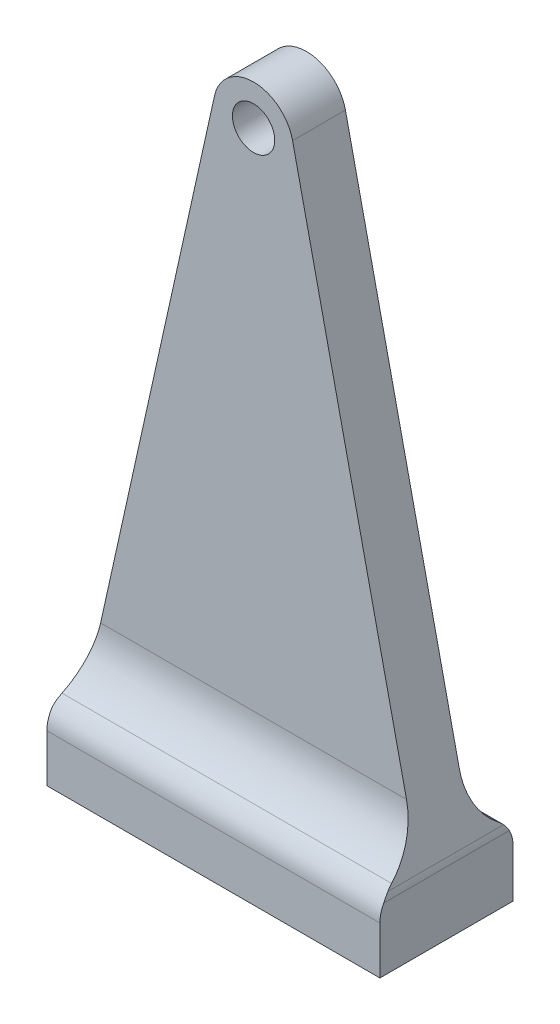
ISO-10303-21;
HEADER;
FILE_DESCRIPTION(('STEP AP214'),'2;1');
FILE_NAME('part.step','',(''),(''),'','','');
FILE_SCHEMA(('AUTOMOTIVE_DESIGN { 1 0 10303 214 1 1 1 1 }'));
ENDSEC;
DATA;
#1=APPLICATION_CONTEXT('core data for automotive mechanical design processes');
#2=APPLICATION_PROTOCOL_DEFINITION('international standard','automotive_design',2000,#1);
#3=PRODUCT_CONTEXT('',#1,'mechanical');
#4=PRODUCT('Part','Part','',(#3));
#5=PRODUCT_RELATED_PRODUCT_CATEGORY('part','',(#4));
#6=PRODUCT_DEFINITION_FORMATION('','',#4);
#7=PRODUCT_DEFINITION_CONTEXT('part definition',#1,'design');
#8=PRODUCT_DEFINITION('design','',#6,#7);
#9=PRODUCT_DEFINITION_SHAPE('','',#8);
#10=(LENGTH_UNIT() NAMED_UNIT(*) SI_UNIT(.MILLI.,.METRE.));
#11=(NAMED_UNIT(*) PLANE_ANGLE_UNIT() SI_UNIT($,.RADIAN.));
#12=(NAMED_UNIT(*) SI_UNIT($,.STERADIAN.) SOLID_ANGLE_UNIT());
#13=UNCERTAINTY_MEASURE_WITH_UNIT(LENGTH_MEASURE(1.E-05),#10,'distance_accuracy_value','');
#14=(GEOMETRIC_REPRESENTATION_CONTEXT(3) GLOBAL_UNCERTAINTY_ASSIGNED_CONTEXT((#13)) GLOBAL_UNIT_ASSIGNED_CONTEXT((#10,
#11,#12)) REPRESENTATION_CONTEXT('',''));
#15=CARTESIAN_POINT('',(0.,0.,0.));
#16=DIRECTION('',(0.,0.,1.));
#17=DIRECTION('',(1.,0.,0.));
#18=AXIS2_PLACEMENT_3D('',#15,#16,#17);
#19=CARTESIAN_POINT('',(0.,85.,20.));
#20=DIRECTION('',(0.,0.,1.));
#21=DIRECTION('',(1.,0.,0.));
#22=AXIS2_PLACEMENT_3D('',#19,#20,#21);
#23=PLANE('',#22);
#24=DIRECTION('',(0.,1.,0.));
#25=VECTOR('',#24,1.);
#26=CARTESIAN_POINT('',(25.,0.,20.));
#27=LINE('',#26,#25);
#28=CARTESIAN_POINT('',(25.,-10.,20.));
#29=VERTEX_POINT('',#28);
#30=CARTESIAN_POINT('',(25.,-2.84464736703942,20.));
#31=VERTEX_POINT('',#30);
#32=EDGE_CURVE('E173',#29,#31,#27,.T.);
#33=ORIENTED_EDGE('',*,*,#32,.T.);
#34=DIRECTION('',(-1.,0.,0.));
#35=VECTOR('',#34,1.);
#36=CARTESIAN_POINT('',(-25.,-2.84464736703942,20.));
#37=LINE('',#36,#35);
#38=CARTESIAN_POINT('',(-25.,-2.84464736703942,20.));
#39=VERTEX_POINT('',#38);
#40=EDGE_CURVE('E55',#31,#39,#37,.T.);
#41=ORIENTED_EDGE('',*,*,#40,.T.);
#42=DIRECTION('',(0.,-1.,0.));
#43=VECTOR('',#42,1.);
#44=CARTESIAN_POINT('',(-25.,0.,20.));
#45=LINE('',#44,#43);
#46=CARTESIAN_POINT('',(-25.,-10.,20.));
#47=VERTEX_POINT('',#46);
#48=EDGE_CURVE('E338',#39,#47,#45,.T.);
#49=ORIENTED_EDGE('',*,*,#48,.T.);
#50=DIRECTION('',(1.,0.,0.));
#51=VECTOR('',#50,1.);
#52=CARTESIAN_POINT('',(-25.,-10.,20.));
#53=LINE('',#52,#51);
#54=EDGE_CURVE('E179',#47,#29,#53,.T.);
#55=ORIENTED_EDGE('',*,*,#54,.T.);
#56=EDGE_LOOP('',(#33,#41,#49,#55));
#57=FACE_BOUND('',#56,.T.);
#58=ADVANCED_FACE('F41',(#57),#23,.T.);
#59=CARTESIAN_POINT('',(0.,85.,0.));
#60=DIRECTION('',(0.,0.,1.));
#61=DIRECTION('',(1.,0.,0.));
#62=AXIS2_PLACEMENT_3D('',#59,#60,#61);
#63=PLANE('',#62);
#64=DIRECTION('',(0.,-1.,0.));
#65=VECTOR('',#64,1.);
#66=CARTESIAN_POINT('',(-25.,0.,0.));
#67=LINE('',#66,#65);
#68=CARTESIAN_POINT('',(-25.,-2.84464736703942,0.));
#69=VERTEX_POINT('',#68);
#70=CARTESIAN_POINT('',(-25.,-10.,0.));
#71=VERTEX_POINT('',#70);
#72=EDGE_CURVE('E337',#69,#71,#67,.T.);
#73=ORIENTED_EDGE('',*,*,#72,.F.);
#74=DIRECTION('',(1.,0.,0.));
#75=VECTOR('',#74,1.);
#76=CARTESIAN_POINT('',(0.,-2.84464736703942,0.));
#77=LINE('',#76,#75);
#78=CARTESIAN_POINT('',(25.,-2.84464736703942,0.));
#79=VERTEX_POINT('',#78);
#80=EDGE_CURVE('E234',#69,#79,#77,.T.);
#81=ORIENTED_EDGE('',*,*,#80,.T.);
#82=DIRECTION('',(0.,1.,0.));
#83=VECTOR('',#82,1.);
#84=CARTESIAN_POINT('',(25.,0.,0.));
#85=LINE('',#84,#83);
#86=CARTESIAN_POINT('',(25.,-10.,0.));
#87=VERTEX_POINT('',#86);
#88=EDGE_CURVE('E182',#87,#79,#85,.T.);
#89=ORIENTED_EDGE('',*,*,#88,.F.);
#90=DIRECTION('',(1.,0.,0.));
#91=VECTOR('',#90,1.);
#92=CARTESIAN_POINT('',(-25.,-10.,0.));
#93=LINE('',#92,#91);
#94=EDGE_CURVE('E341',#71,#87,#93,.T.);
#95=ORIENTED_EDGE('',*,*,#94,.F.);
#96=EDGE_LOOP('',(#73,#81,#89,#95));
#97=FACE_BOUND('',#96,.T.);
#98=ADVANCED_FACE('F274',(#97),#63,.F.);
#99=CARTESIAN_POINT('',(0.,85.,20.));
#100=DIRECTION('',(0.,0.,-1.));
#101=DIRECTION('',(-1.,0.,0.));
#102=AXIS2_PLACEMENT_3D('',#99,#100,#101);
#103=CYLINDRICAL_SURFACE('',#102,6.);
#104=CARTESIAN_POINT('',(0.,85.,13.96875));
#105=DIRECTION('',(0.,0.,1.));
#106=DIRECTION('',(1.,0.,0.));
#107=AXIS2_PLACEMENT_3D('',#104,#105,#106);
#108=CIRCLE('',#107,6.);
#109=CARTESIAN_POINT('',(5.85762860973803,86.2993025322759,13.96875));
#110=VERTEX_POINT('',#109);
#111=CARTESIAN_POINT('',(-5.85762860973803,86.2993025322759,13.96875));
#112=VERTEX_POINT('',#111);
#113=EDGE_CURVE('E171',#110,#112,#108,.T.);
#114=ORIENTED_EDGE('',*,*,#113,.F.);
#115=DIRECTION('',(0.,0.,-1.));
#116=VECTOR('',#115,1.);
#117=CARTESIAN_POINT('',(5.85762860973803,86.2993025322759,20.));
#118=LINE('',#117,#116);
#119=CARTESIAN_POINT('',(5.85762860973803,86.2993025322759,6.03125));
#120=VERTEX_POINT('',#119);
#121=EDGE_CURVE('E164',#110,#120,#118,.T.);
#122=ORIENTED_EDGE('',*,*,#121,.T.);
#123=CARTESIAN_POINT('',(0.,85.,6.03125));
#124=DIRECTION('',(0.,0.,-1.));
#125=DIRECTION('',(-1.,0.,0.));
#126=AXIS2_PLACEMENT_3D('',#123,#124,#125);
#127=CIRCLE('',#126,6.);
#128=CARTESIAN_POINT('',(-5.85762860973803,86.2993025322759,6.03125));
#129=VERTEX_POINT('',#128);
#130=EDGE_CURVE('E147',#129,#120,#127,.T.);
#131=ORIENTED_EDGE('',*,*,#130,.F.);
#132=DIRECTION('',(0.,0.,-1.));
#133=VECTOR('',#132,1.);
#134=CARTESIAN_POINT('',(-5.85762860973803,86.2993025322759,20.));
#135=LINE('',#134,#133);
#136=EDGE_CURVE('E187',#112,#129,#135,.T.);
#137=ORIENTED_EDGE('',*,*,#136,.F.);
#138=EDGE_LOOP('',(#114,#122,#131,#137));
#139=FACE_BOUND('',#138,.T.);
#140=ADVANCED_FACE('F170',(#139),#103,.T.);
#141=CARTESIAN_POINT('',(-5.85762860973803,86.2993025322759,20.));
#142=DIRECTION('',(0.976271434956338,-0.216550422045982,0.));
#143=DIRECTION('',(0.216550422045982,0.976271434956338,0.));
#144=AXIS2_PLACEMENT_3D('',#141,#142,#143);
#145=PLANE('',#144);
#146=CARTESIAN_POINT('',(-22.964032271261,9.17872667843966,-3.96875));
#147=DIRECTION('',(0.976271434956338,-0.216550422045982,0.));
#148=DIRECTION('',(0.216550422045982,0.976271434956338,0.));
#149=AXIS2_PLACEMENT_3D('',#146,#147,#148);
#150=ELLIPSE('',#149,10.2430529481253,10.);
#151=CARTESIAN_POINT('',(-22.964032271261,9.17872667843965,6.03125));
#152=VERTEX_POINT('',#151);
#153=CARTESIAN_POINT('',(-24.7419986787842,1.16314398145361,2.01041666666667));
#154=VERTEX_POINT('',#153);
#155=EDGE_CURVE('E199',#152,#154,#150,.T.);
#156=ORIENTED_EDGE('',*,*,#155,.T.);
#157=CARTESIAN_POINT('',(-25.6309818825457,-2.84464736703942,5.));
#158=DIRECTION('',(0.976271434956338,-0.216550422045982,0.));
#159=DIRECTION('',(0.216550422045982,0.976271434956338,0.));
#160=AXIS2_PLACEMENT_3D('',#157,#158,#159);
#161=ELLIPSE('',#160,5.12152647406263,5.);
#162=CARTESIAN_POINT('',(-24.8813571747817,0.534875896933393,1.31505461258016));
#163=VERTEX_POINT('',#162);
#164=EDGE_CURVE('E220',#154,#163,#161,.F.);
#165=ORIENTED_EDGE('',*,*,#164,.T.);
#166=DIRECTION('',(0.,0.,-1.));
#167=VECTOR('',#166,1.);
#168=CARTESIAN_POINT('',(-24.8813571747817,0.534875896933393,20.));
#169=LINE('',#168,#167);
#170=CARTESIAN_POINT('',(-24.8813571747817,0.534875896933393,18.6849453874198));
#171=VERTEX_POINT('',#170);
#172=EDGE_CURVE('E217',#163,#171,#169,.F.);
#173=ORIENTED_EDGE('',*,*,#172,.T.);
#174=CARTESIAN_POINT('',(-25.6309818825457,-2.84464736703942,15.));
#175=DIRECTION('',(0.976271434956338,-0.216550422045982,0.));
#176=DIRECTION('',(0.216550422045982,0.976271434956338,0.));
#177=AXIS2_PLACEMENT_3D('',#174,#175,#176);
#178=ELLIPSE('',#177,5.12152647406263,5.);
#179=CARTESIAN_POINT('',(-24.7419986787842,1.1631439814536,17.9895833333333));
#180=VERTEX_POINT('',#179);
#181=EDGE_CURVE('E215',#171,#180,#178,.F.);
#182=ORIENTED_EDGE('',*,*,#181,.T.);
#183=CARTESIAN_POINT('',(-22.964032271261,9.17872667843966,23.96875));
#184=DIRECTION('',(0.976271434956338,-0.216550422045982,0.));
#185=DIRECTION('',(0.216550422045982,0.976271434956338,0.));
#186=AXIS2_PLACEMENT_3D('',#183,#184,#185);
#187=ELLIPSE('',#186,10.2430529481253,10.);
#188=CARTESIAN_POINT('',(-22.964032271261,9.17872667843965,13.96875));
#189=VERTEX_POINT('',#188);
#190=EDGE_CURVE('E203',#180,#189,#187,.T.);
#191=ORIENTED_EDGE('',*,*,#190,.T.);
#192=DIRECTION('',(-0.216550422045982,-0.976271434956338,0.));
#193=VECTOR('',#192,1.);
#194=CARTESIAN_POINT('',(-5.85762860973803,86.2993025322759,13.96875));
#195=LINE('',#194,#193);
#196=EDGE_CURVE('E335',#112,#189,#195,.T.);
#197=ORIENTED_EDGE('',*,*,#196,.F.);
#198=ORIENTED_EDGE('',*,*,#136,.T.);
#199=DIRECTION('',(0.216550422045982,0.976271434956338,0.));
#200=VECTOR('',#199,1.);
#201=CARTESIAN_POINT('',(-5.85762860973803,86.2993025322759,6.03125));
#202=LINE('',#201,#200);
#203=EDGE_CURVE('E154',#152,#129,#202,.T.);
#204=ORIENTED_EDGE('',*,*,#203,.F.);
#205=EDGE_LOOP('',(#156,#165,#173,#182,#191,#197,#198,#204));
#206=FACE_BOUND('',#205,.T.);
#207=ADVANCED_FACE('F290',(#206),#145,.F.);
#208=CARTESIAN_POINT('',(5.85762860973803,86.2993025322759,20.));
#209=DIRECTION('',(-0.976271434956338,-0.216550422045982,0.));
#210=DIRECTION('',(0.216550422045982,-0.976271434956338,0.));
#211=AXIS2_PLACEMENT_3D('',#208,#209,#210);
#212=PLANE('',#211);
#213=DIRECTION('',(0.,0.,-1.));
#214=VECTOR('',#213,1.);
#215=CARTESIAN_POINT('',(24.8813571747817,0.534875896933393,20.));
#216=LINE('',#215,#214);
#217=CARTESIAN_POINT('',(24.8813571747817,0.534875896933393,18.6849453874198));
#218=VERTEX_POINT('',#217);
#219=CARTESIAN_POINT('',(24.8813571747817,0.534875896933393,1.31505461258015));
#220=VERTEX_POINT('',#219);
#221=EDGE_CURVE('E224',#218,#220,#216,.T.);
#222=ORIENTED_EDGE('',*,*,#221,.T.);
#223=CARTESIAN_POINT('',(25.6309818825457,-2.84464736703942,5.));
#224=DIRECTION('',(-0.976271434956338,-0.216550422045982,0.));
#225=DIRECTION('',(0.216550422045982,-0.976271434956338,0.));
#226=AXIS2_PLACEMENT_3D('',#223,#224,#225);
#227=ELLIPSE('',#226,5.12152647406263,5.);
#228=CARTESIAN_POINT('',(24.7419986787842,1.16314398145361,2.01041666666667));
#229=VERTEX_POINT('',#228);
#230=EDGE_CURVE('E226',#220,#229,#227,.F.);
#231=ORIENTED_EDGE('',*,*,#230,.T.);
#232=CARTESIAN_POINT('',(22.964032271261,9.17872667843966,-3.96875));
#233=DIRECTION('',(-0.976271434956338,-0.216550422045982,0.));
#234=DIRECTION('',(0.216550422045982,-0.976271434956338,0.));
#235=AXIS2_PLACEMENT_3D('',#232,#233,#234);
#236=ELLIPSE('',#235,10.2430529481253,10.);
#237=CARTESIAN_POINT('',(22.964032271261,9.17872667843965,6.03125));
#238=VERTEX_POINT('',#237);
#239=EDGE_CURVE('E166',#229,#238,#236,.T.);
#240=ORIENTED_EDGE('',*,*,#239,.T.);
#241=DIRECTION('',(0.216550422045982,-0.976271434956338,0.));
#242=VECTOR('',#241,1.);
#243=CARTESIAN_POINT('',(5.85762860973803,86.2993025322759,6.03125));
#244=LINE('',#243,#242);
#245=EDGE_CURVE('E151',#120,#238,#244,.T.);
#246=ORIENTED_EDGE('',*,*,#245,.F.);
#247=ORIENTED_EDGE('',*,*,#121,.F.);
#248=DIRECTION('',(-0.216550422045982,0.976271434956338,0.));
#249=VECTOR('',#248,1.);
#250=CARTESIAN_POINT('',(5.85762860973803,86.2993025322759,13.96875));
#251=LINE('',#250,#249);
#252=CARTESIAN_POINT('',(22.964032271261,9.17872667843965,13.96875));
#253=VERTEX_POINT('',#252);
#254=EDGE_CURVE('E195',#253,#110,#251,.T.);
#255=ORIENTED_EDGE('',*,*,#254,.F.);
#256=CARTESIAN_POINT('',(22.964032271261,9.17872667843966,23.96875));
#257=DIRECTION('',(-0.976271434956338,-0.216550422045982,0.));
#258=DIRECTION('',(0.216550422045982,-0.976271434956338,0.));
#259=AXIS2_PLACEMENT_3D('',#256,#257,#258);
#260=ELLIPSE('',#259,10.2430529481253,10.);
#261=CARTESIAN_POINT('',(24.7419986787842,1.16314398145361,17.9895833333333));
#262=VERTEX_POINT('',#261);
#263=EDGE_CURVE('E205',#253,#262,#260,.T.);
#264=ORIENTED_EDGE('',*,*,#263,.T.);
#265=CARTESIAN_POINT('',(25.6309818825457,-2.84464736703942,15.));
#266=DIRECTION('',(-0.976271434956338,-0.216550422045982,0.));
#267=DIRECTION('',(0.216550422045982,-0.976271434956338,0.));
#268=AXIS2_PLACEMENT_3D('',#265,#266,#267);
#269=ELLIPSE('',#268,5.12152647406263,5.);
#270=EDGE_CURVE('E222',#262,#218,#269,.F.);
#271=ORIENTED_EDGE('',*,*,#270,.T.);
#272=EDGE_LOOP('',(#222,#231,#240,#246,#247,#255,#264,#271));
#273=FACE_BOUND('',#272,.T.);
#274=ADVANCED_FACE('F162',(#273),#212,.F.);
#275=CARTESIAN_POINT('',(-25.,0.,20.));
#276=DIRECTION('',(1.,0.,0.));
#277=DIRECTION('',(0.,0.,-1.));
#278=AXIS2_PLACEMENT_3D('',#275,#276,#277);
#279=PLANE('',#278);
#280=DIRECTION('',(0.,0.,-1.));
#281=VECTOR('',#280,1.);
#282=CARTESIAN_POINT('',(-25.,-0.547876213296505,20.));
#283=LINE('',#282,#281);
#284=CARTESIAN_POINT('',(-25.,-0.547876213296505,19.4412658406511));
#285=VERTEX_POINT('',#284);
#286=CARTESIAN_POINT('',(-25.,-0.547876213296505,0.558734159348869));
#287=VERTEX_POINT('',#286);
#288=EDGE_CURVE('E210',#285,#287,#283,.T.);
#289=ORIENTED_EDGE('',*,*,#288,.T.);
#290=CARTESIAN_POINT('',(-25.,-2.84464736703942,5.));
#291=DIRECTION('',(1.,0.,0.));
#292=DIRECTION('',(0.,0.,-1.));
#293=AXIS2_PLACEMENT_3D('',#290,#291,#292);
#294=CIRCLE('',#293,5.);
#295=EDGE_CURVE('E213',#287,#69,#294,.F.);
#296=ORIENTED_EDGE('',*,*,#295,.T.);
#297=ORIENTED_EDGE('',*,*,#72,.T.);
#298=DIRECTION('',(0.,0.,-1.));
#299=VECTOR('',#298,1.);
#300=CARTESIAN_POINT('',(-25.,-10.,20.));
#301=LINE('',#300,#299);
#302=EDGE_CURVE('E176',#47,#71,#301,.T.);
#303=ORIENTED_EDGE('',*,*,#302,.F.);
#304=ORIENTED_EDGE('',*,*,#48,.F.);
#305=CARTESIAN_POINT('',(-25.,-2.84464736703942,15.));
#306=DIRECTION('',(1.,0.,0.));
#307=DIRECTION('',(0.,0.,-1.));
#308=AXIS2_PLACEMENT_3D('',#305,#306,#307);
#309=CIRCLE('',#308,5.);
#310=EDGE_CURVE('E208',#39,#285,#309,.F.);
#311=ORIENTED_EDGE('',*,*,#310,.T.);
#312=EDGE_LOOP('',(#289,#296,#297,#303,#304,#311));
#313=FACE_BOUND('',#312,.T.);
#314=ADVANCED_FACE('F289',(#313),#279,.F.);
#315=CARTESIAN_POINT('',(-25.,-10.,20.));
#316=DIRECTION('',(0.,1.,0.));
#317=DIRECTION('',(0.,0.,1.));
#318=AXIS2_PLACEMENT_3D('',#315,#316,#317);
#319=PLANE('',#318);
#320=CARTESIAN_POINT('',(-15.5,-10.,5.5));
#321=DIRECTION('',(0.,-1.,0.));
#322=DIRECTION('',(0.,0.,-1.));
#323=AXIS2_PLACEMENT_3D('',#320,#321,#322);
#324=CIRCLE('',#323,2.38125);
#325=CARTESIAN_POINT('',(-15.5,-10.,3.11875));
#326=VERTEX_POINT('',#325);
#327=EDGE_CURVE('E416',#326,#326,#324,.T.);
#328=ORIENTED_EDGE('',*,*,#327,.F.);
#329=EDGE_LOOP('',(#328));
#330=FACE_BOUND('',#329,.T.);
#331=CARTESIAN_POINT('',(15.5,-10.,14.5));
#332=DIRECTION('',(0.,-1.,0.));
#333=DIRECTION('',(0.,0.,-1.));
#334=AXIS2_PLACEMENT_3D('',#331,#332,#333);
#335=CIRCLE('',#334,2.38125);
#336=CARTESIAN_POINT('',(15.5,-10.,12.11875));
#337=VERTEX_POINT('',#336);
#338=EDGE_CURVE('E412',#337,#337,#335,.T.);
#339=ORIENTED_EDGE('',*,*,#338,.F.);
#340=EDGE_LOOP('',(#339));
#341=FACE_BOUND('',#340,.T.);
#342=CARTESIAN_POINT('',(15.5,-10.,5.5));
#343=DIRECTION('',(0.,-1.,0.));
#344=DIRECTION('',(0.,0.,-1.));
#345=AXIS2_PLACEMENT_3D('',#342,#343,#344);
#346=CIRCLE('',#345,2.38125);
#347=CARTESIAN_POINT('',(15.5,-10.,3.11875));
#348=VERTEX_POINT('',#347);
#349=EDGE_CURVE('E407',#348,#348,#346,.T.);
#350=ORIENTED_EDGE('',*,*,#349,.F.);
#351=EDGE_LOOP('',(#350));
#352=FACE_BOUND('',#351,.T.);
#353=CARTESIAN_POINT('',(-15.5,-10.,14.5));
#354=DIRECTION('',(0.,-1.,0.));
#355=DIRECTION('',(0.,0.,-1.));
#356=AXIS2_PLACEMENT_3D('',#353,#354,#355);
#357=CIRCLE('',#356,2.38125);
#358=CARTESIAN_POINT('',(-15.5,-10.,12.11875));
#359=VERTEX_POINT('',#358);
#360=EDGE_CURVE('E419',#359,#359,#357,.T.);
#361=ORIENTED_EDGE('',*,*,#360,.F.);
#362=EDGE_LOOP('',(#361));
#363=FACE_BOUND('',#362,.T.);
#364=ORIENTED_EDGE('',*,*,#94,.T.);
#365=DIRECTION('',(0.,0.,-1.));
#366=VECTOR('',#365,1.);
#367=CARTESIAN_POINT('',(25.,-10.,20.));
#368=LINE('',#367,#366);
#369=EDGE_CURVE('E172',#29,#87,#368,.T.);
#370=ORIENTED_EDGE('',*,*,#369,.F.);
#371=ORIENTED_EDGE('',*,*,#54,.F.);
#372=ORIENTED_EDGE('',*,*,#302,.T.);
#373=EDGE_LOOP('',(#364,#370,#371,#372));
#374=FACE_BOUND('',#373,.T.);
#375=ADVANCED_FACE('F294',(#330,#341,#352,#363,#374),#319,.F.);
#376=CARTESIAN_POINT('',(25.,0.,20.));
#377=DIRECTION('',(-1.,0.,0.));
#378=DIRECTION('',(0.,0.,1.));
#379=AXIS2_PLACEMENT_3D('',#376,#377,#378);
#380=PLANE('',#379);
#381=ORIENTED_EDGE('',*,*,#88,.T.);
#382=CARTESIAN_POINT('',(25.,-2.84464736703942,5.));
#383=DIRECTION('',(-1.,0.,0.));
#384=DIRECTION('',(0.,0.,1.));
#385=AXIS2_PLACEMENT_3D('',#382,#383,#384);
#386=CIRCLE('',#385,5.);
#387=CARTESIAN_POINT('',(25.,-0.547876213296508,0.558734159348866));
#388=VERTEX_POINT('',#387);
#389=EDGE_CURVE('E63',#79,#388,#386,.F.);
#390=ORIENTED_EDGE('',*,*,#389,.T.);
#391=DIRECTION('',(0.,0.,-1.));
#392=VECTOR('',#391,1.);
#393=CARTESIAN_POINT('',(25.,-0.547876213296508,20.));
#394=LINE('',#393,#392);
#395=CARTESIAN_POINT('',(25.,-0.547876213296508,19.4412658406511));
#396=VERTEX_POINT('',#395);
#397=EDGE_CURVE('E67',#388,#396,#394,.F.);
#398=ORIENTED_EDGE('',*,*,#397,.T.);
#399=CARTESIAN_POINT('',(25.,-2.84464736703942,15.));
#400=DIRECTION('',(-1.,0.,0.));
#401=DIRECTION('',(0.,0.,1.));
#402=AXIS2_PLACEMENT_3D('',#399,#400,#401);
#403=CIRCLE('',#402,5.);
#404=EDGE_CURVE('E228',#396,#31,#403,.F.);
#405=ORIENTED_EDGE('',*,*,#404,.T.);
#406=ORIENTED_EDGE('',*,*,#32,.F.);
#407=ORIENTED_EDGE('',*,*,#369,.T.);
#408=EDGE_LOOP('',(#381,#390,#398,#405,#406,#407));
#409=FACE_BOUND('',#408,.T.);
#410=ADVANCED_FACE('F291',(#409),#380,.F.);
#411=CARTESIAN_POINT('',(25.,91.,6.03125));
#412=DIRECTION('',(0.,0.,-1.));
#413=DIRECTION('',(-1.,0.,0.));
#414=AXIS2_PLACEMENT_3D('',#411,#412,#413);
#415=PLANE('',#414);
#416=CARTESIAN_POINT('',(0.,85.,6.03125));
#417=DIRECTION('',(0.,0.,-1.));
#418=DIRECTION('',(-1.,0.,0.));
#419=AXIS2_PLACEMENT_3D('',#416,#417,#418);
#420=CIRCLE('',#419,3.17499999999998);
#421=CARTESIAN_POINT('',(-3.17499999999998,85.,6.03125));
#422=VERTEX_POINT('',#421);
#423=EDGE_CURVE('E167',#422,#422,#420,.T.);
#424=ORIENTED_EDGE('',*,*,#423,.F.);
#425=EDGE_LOOP('',(#424));
#426=FACE_BOUND('',#425,.T.);
#427=ORIENTED_EDGE('',*,*,#245,.T.);
#428=DIRECTION('',(-1.,0.,0.));
#429=VECTOR('',#428,1.);
#430=CARTESIAN_POINT('',(-25.,9.17872667843966,6.03125));
#431=LINE('',#430,#429);
#432=EDGE_CURVE('E189',#238,#152,#431,.T.);
#433=ORIENTED_EDGE('',*,*,#432,.T.);
#434=ORIENTED_EDGE('',*,*,#203,.T.);
#435=ORIENTED_EDGE('',*,*,#130,.T.);
#436=EDGE_LOOP('',(#427,#433,#434,#435));
#437=FACE_BOUND('',#436,.T.);
#438=ADVANCED_FACE('F149',(#426,#437),#415,.T.);
#439=CARTESIAN_POINT('',(25.,0.,13.96875));
#440=DIRECTION('',(0.,0.,1.));
#441=DIRECTION('',(1.,0.,0.));
#442=AXIS2_PLACEMENT_3D('',#439,#440,#441);
#443=PLANE('',#442);
#444=CARTESIAN_POINT('',(0.,85.,13.96875));
#445=DIRECTION('',(0.,0.,1.));
#446=DIRECTION('',(1.,0.,0.));
#447=AXIS2_PLACEMENT_3D('',#444,#445,#446);
#448=CIRCLE('',#447,3.17499999999998);
#449=CARTESIAN_POINT('',(3.17499999999998,85.,13.96875));
#450=VERTEX_POINT('',#449);
#451=EDGE_CURVE('E192',#450,#450,#448,.T.);
#452=ORIENTED_EDGE('',*,*,#451,.F.);
#453=EDGE_LOOP('',(#452));
#454=FACE_BOUND('',#453,.T.);
#455=ORIENTED_EDGE('',*,*,#196,.T.);
#456=DIRECTION('',(-1.,0.,0.));
#457=VECTOR('',#456,1.);
#458=CARTESIAN_POINT('',(25.,9.17872667843966,13.96875));
#459=LINE('',#458,#457);
#460=EDGE_CURVE('E197',#189,#253,#459,.F.);
#461=ORIENTED_EDGE('',*,*,#460,.T.);
#462=ORIENTED_EDGE('',*,*,#254,.T.);
#463=ORIENTED_EDGE('',*,*,#113,.T.);
#464=EDGE_LOOP('',(#455,#461,#462,#463));
#465=FACE_BOUND('',#464,.T.);
#466=ADVANCED_FACE('F358',(#454,#465),#443,.T.);
#467=CARTESIAN_POINT('',(0.,85.,20.));
#468=DIRECTION('',(0.,0.,-1.));
#469=DIRECTION('',(-1.,0.,0.));
#470=AXIS2_PLACEMENT_3D('',#467,#468,#469);
#471=CYLINDRICAL_SURFACE('',#470,3.17499999999998);
#472=ORIENTED_EDGE('',*,*,#423,.T.);
#473=EDGE_LOOP('',(#472));
#474=FACE_BOUND('',#473,.T.);
#475=ORIENTED_EDGE('',*,*,#451,.T.);
#476=EDGE_LOOP('',(#475));
#477=FACE_BOUND('',#476,.T.);
#478=ADVANCED_FACE('F284',(#474,#477),#471,.F.);
#479=CARTESIAN_POINT('',(25.,9.17872667843966,-3.96875));
#480=DIRECTION('',(1.,0.,0.));
#481=DIRECTION('',(0.,0.,-1.));
#482=AXIS2_PLACEMENT_3D('',#479,#480,#481);
#483=CYLINDRICAL_SURFACE('',#482,10.);
#484=ORIENTED_EDGE('',*,*,#239,.F.);
#485=DIRECTION('',(1.,0.,0.));
#486=VECTOR('',#485,1.);
#487=CARTESIAN_POINT('',(25.,1.16314398145361,2.01041666666667));
#488=LINE('',#487,#486);
#489=EDGE_CURVE('E232',#229,#154,#488,.F.);
#490=ORIENTED_EDGE('',*,*,#489,.T.);
#491=ORIENTED_EDGE('',*,*,#155,.F.);
#492=ORIENTED_EDGE('',*,*,#432,.F.);
#493=EDGE_LOOP('',(#484,#490,#491,#492));
#494=FACE_BOUND('',#493,.T.);
#495=ADVANCED_FACE('F306',(#494),#483,.F.);
#496=CARTESIAN_POINT('',(25.,9.17872667843966,23.96875));
#497=DIRECTION('',(1.,0.,0.));
#498=DIRECTION('',(0.,0.,-1.));
#499=AXIS2_PLACEMENT_3D('',#496,#497,#498);
#500=CYLINDRICAL_SURFACE('',#499,10.);
#501=ORIENTED_EDGE('',*,*,#190,.F.);
#502=DIRECTION('',(1.,0.,0.));
#503=VECTOR('',#502,1.);
#504=CARTESIAN_POINT('',(25.,1.16314398145361,17.9895833333333));
#505=LINE('',#504,#503);
#506=EDGE_CURVE('E11',#180,#262,#505,.T.);
#507=ORIENTED_EDGE('',*,*,#506,.T.);
#508=ORIENTED_EDGE('',*,*,#263,.F.);
#509=ORIENTED_EDGE('',*,*,#460,.F.);
#510=EDGE_LOOP('',(#501,#507,#508,#509));
#511=FACE_BOUND('',#510,.T.);
#512=ADVANCED_FACE('F270',(#511),#500,.F.);
#513=CARTESIAN_POINT('',(20.,-0.547876213296508,20.));
#514=DIRECTION('',(0.,0.,-1.));
#515=DIRECTION('',(-1.,0.,0.));
#516=AXIS2_PLACEMENT_3D('',#513,#514,#515);
#517=CYLINDRICAL_SURFACE('',#516,5.);
#518=CARTESIAN_POINT('',(24.8813571747817,0.534875896933401,1.31505461258015));
#519=CARTESIAN_POINT('',(24.8993095347509,0.453961478653577,1.24083749645578));
#520=CARTESIAN_POINT('',(24.9157314883612,0.370387308169808,1.16910752602735));
#521=CARTESIAN_POINT('',(24.9446933793269,0.19879924266109,1.03144296724537));
#522=CARTESIAN_POINT('',(24.957255895062,0.110814813801808,0.965476353013063));
#523=CARTESIAN_POINT('',(24.9779107237593,-0.0697012613967613,0.83925544712251));
#524=CARTESIAN_POINT('',(24.9860024025154,-0.162233550841925,0.779001966898834));
#525=CARTESIAN_POINT('',(24.9970674389728,-0.35186846350124,0.664282469895833));
#526=CARTESIAN_POINT('',(25.0000097816912,-0.448995186680812,0.609853364194832));
#527=CARTESIAN_POINT('',(25.,-0.54787621329652,0.558734159348879));
#528=B_SPLINE_CURVE_WITH_KNOTS('',3,(#518,#519,#520,#521,#522,#523,#524,#525,#526,#527),
.UNSPECIFIED.,.F.,.F.,(4,2,2,2,4),(0.,0.333736015674613,0.665480710576849,0.997272452713311,
1.33105582042846),.UNSPECIFIED.);
#529=EDGE_CURVE('E326',#220,#388,#528,.T.);
#530=ORIENTED_EDGE('',*,*,#529,.F.);
#531=ORIENTED_EDGE('',*,*,#221,.F.);
#532=CARTESIAN_POINT('',(25.,-0.547876213296508,19.4412658406511));
#533=CARTESIAN_POINT('',(25.0000097816912,-0.448995186680805,19.3901466358052));
#534=CARTESIAN_POINT('',(24.9970674389728,-0.351868463501235,19.3357175301042));
#535=CARTESIAN_POINT('',(24.9860024025154,-0.162233550841923,19.2209980331012));
#536=CARTESIAN_POINT('',(24.9779107237593,-0.0697012613967589,19.1607445528775));
#537=CARTESIAN_POINT('',(24.957255895062,0.110814813801813,19.0345236469869));
#538=CARTESIAN_POINT('',(24.9446933793269,0.198799242661097,18.9685570327546));
#539=CARTESIAN_POINT('',(24.9157314883612,0.370387308169812,18.8308924739726));
#540=CARTESIAN_POINT('',(24.8993095347509,0.453961478653575,18.7591625035442));
#541=CARTESIAN_POINT('',(24.8813571747817,0.534875896933385,18.6849453874198));
#542=B_SPLINE_CURVE_WITH_KNOTS('',3,(#532,#533,#534,#535,#536,#537,#538,#539,#540,#541),
.UNSPECIFIED.,.F.,.F.,(4,2,2,2,4),(0.,0.333783367715148,0.665575109851612,0.997319804753849,
1.33105582042846),.UNSPECIFIED.);
#543=EDGE_CURVE('E46',#396,#218,#542,.T.);
#544=ORIENTED_EDGE('',*,*,#543,.F.);
#545=ORIENTED_EDGE('',*,*,#397,.F.);
#546=EDGE_LOOP('',(#530,#531,#544,#545));
#547=FACE_BOUND('',#546,.T.);
#548=ADVANCED_FACE('F43',(#547),#517,.T.);
#549=CARTESIAN_POINT('',(25.,-2.84464736703942,15.));
#550=DIRECTION('',(1.,0.,0.));
#551=DIRECTION('',(0.,0.,-1.));
#552=AXIS2_PLACEMENT_3D('',#549,#550,#551);
#553=CYLINDRICAL_SURFACE('',#552,5.);
#554=ORIENTED_EDGE('',*,*,#506,.F.);
#555=ORIENTED_EDGE('',*,*,#181,.F.);
#556=CARTESIAN_POINT('',(-24.8813571747817,0.534875896933403,18.6849453874198));
#557=CARTESIAN_POINT('',(-24.8993095347509,0.45396147865358,18.7591625035442));
#558=CARTESIAN_POINT('',(-24.9157314883612,0.370387308169812,18.8308924739726));
#559=CARTESIAN_POINT('',(-24.9446933793269,0.198799242661094,18.9685570327546));
#560=CARTESIAN_POINT('',(-24.957255895062,0.110814813801813,19.0345236469869));
#561=CARTESIAN_POINT('',(-24.9779107237593,-0.0697012613967555,19.1607445528775));
#562=CARTESIAN_POINT('',(-24.9860024025154,-0.162233550841918,19.2209980331012));
#563=CARTESIAN_POINT('',(-24.9970674389728,-0.351868463501232,19.3357175301042));
#564=CARTESIAN_POINT('',(-25.0000097816912,-0.448995186680806,19.3901466358052));
#565=CARTESIAN_POINT('',(-25.,-0.547876213296516,19.4412658406511));
#566=B_SPLINE_CURVE_WITH_KNOTS('',3,(#556,#557,#558,#559,#560,#561,#562,#563,#564,#565),
.UNSPECIFIED.,.F.,.F.,(4,2,2,2,4),(0.,0.333736015674612,0.665480710576847,0.997272452713306,
1.33105582042846),.UNSPECIFIED.);
#567=EDGE_CURVE('E245',#285,#171,#566,.F.);
#568=ORIENTED_EDGE('',*,*,#567,.F.);
#569=ORIENTED_EDGE('',*,*,#310,.F.);
#570=ORIENTED_EDGE('',*,*,#40,.F.);
#571=ORIENTED_EDGE('',*,*,#404,.F.);
#572=ORIENTED_EDGE('',*,*,#543,.T.);
#573=ORIENTED_EDGE('',*,*,#270,.F.);
#574=EDGE_LOOP('',(#554,#555,#568,#569,#570,#571,#572,#573));
#575=FACE_BOUND('',#574,.T.);
#576=ADVANCED_FACE('F259',(#575),#553,.T.);
#577=CARTESIAN_POINT('',(25.,-2.84464736703942,5.));
#578=DIRECTION('',(1.,0.,0.));
#579=DIRECTION('',(0.,0.,-1.));
#580=AXIS2_PLACEMENT_3D('',#577,#578,#579);
#581=CYLINDRICAL_SURFACE('',#580,5.);
#582=ORIENTED_EDGE('',*,*,#80,.F.);
#583=ORIENTED_EDGE('',*,*,#295,.F.);
#584=CARTESIAN_POINT('',(-25.,-0.547876213296505,0.558734159348869));
#585=CARTESIAN_POINT('',(-25.0000097816912,-0.448995186680802,0.60985336419483));
#586=CARTESIAN_POINT('',(-24.9970674389728,-0.351868463501232,0.664282469895835));
#587=CARTESIAN_POINT('',(-24.9860024025154,-0.162233550841919,0.77900196689884));
#588=CARTESIAN_POINT('',(-24.9779107237593,-0.0697012613967558,0.839255447122515));
#589=CARTESIAN_POINT('',(-24.957255895062,0.110814813801815,0.965476353013067));
#590=CARTESIAN_POINT('',(-24.9446933793269,0.198799242661098,1.03144296724537));
#591=CARTESIAN_POINT('',(-24.9157314883612,0.370387308169813,1.16910752602736));
#592=CARTESIAN_POINT('',(-24.8993095347509,0.453961478653577,1.24083749645579));
#593=CARTESIAN_POINT('',(-24.8813571747817,0.534875896933388,1.31505461258018));
#594=B_SPLINE_CURVE_WITH_KNOTS('',3,(#584,#585,#586,#587,#588,#589,#590,#591,#592,#593),
.UNSPECIFIED.,.F.,.F.,(4,2,2,2,4),(0.,0.333783367715149,0.665575109851611,0.997319804753849,
1.33105582042846),.UNSPECIFIED.);
#595=EDGE_CURVE('E237',#163,#287,#594,.F.);
#596=ORIENTED_EDGE('',*,*,#595,.F.);
#597=ORIENTED_EDGE('',*,*,#164,.F.);
#598=ORIENTED_EDGE('',*,*,#489,.F.);
#599=ORIENTED_EDGE('',*,*,#230,.F.);
#600=ORIENTED_EDGE('',*,*,#529,.T.);
#601=ORIENTED_EDGE('',*,*,#389,.F.);
#602=EDGE_LOOP('',(#582,#583,#596,#597,#598,#599,#600,#601));
#603=FACE_BOUND('',#602,.T.);
#604=ADVANCED_FACE('F251',(#603),#581,.T.);
#605=CARTESIAN_POINT('',(-20.,-0.547876213296505,20.));
#606=DIRECTION('',(0.,0.,-1.));
#607=DIRECTION('',(-1.,0.,0.));
#608=AXIS2_PLACEMENT_3D('',#605,#606,#607);
#609=CYLINDRICAL_SURFACE('',#608,5.);
#610=ORIENTED_EDGE('',*,*,#567,.T.);
#611=ORIENTED_EDGE('',*,*,#172,.F.);
#612=ORIENTED_EDGE('',*,*,#595,.T.);
#613=ORIENTED_EDGE('',*,*,#288,.F.);
#614=EDGE_LOOP('',(#610,#611,#612,#613));
#615=FACE_BOUND('',#614,.T.);
#616=ADVANCED_FACE('F254',(#615),#609,.T.);
#617=CARTESIAN_POINT('',(-15.5,-3.6,14.5));
#618=DIRECTION('',(0.,-1.,0.));
#619=DIRECTION('',(0.,0.,-1.));
#620=AXIS2_PLACEMENT_3D('',#617,#618,#619);
#621=CYLINDRICAL_SURFACE('',#620,2.38125);
#622=CARTESIAN_POINT('',(-15.5,-3.6,14.5));
#623=DIRECTION('',(0.,-1.,0.));
#624=DIRECTION('',(0.,0.,-1.));
#625=AXIS2_PLACEMENT_3D('',#622,#623,#624);
#626=CIRCLE('',#625,2.38125);
#627=CARTESIAN_POINT('',(-15.5,-3.6,12.11875));
#628=VERTEX_POINT('',#627);
#629=EDGE_CURVE('E246',#628,#628,#626,.T.);
#630=ORIENTED_EDGE('',*,*,#629,.F.);
#631=EDGE_LOOP('',(#630));
#632=FACE_BOUND('',#631,.T.);
#633=ORIENTED_EDGE('',*,*,#360,.T.);
#634=EDGE_LOOP('',(#633));
#635=FACE_BOUND('',#634,.T.);
#636=ADVANCED_FACE('F257',(#632,#635),#621,.F.);
#637=CARTESIAN_POINT('',(-15.5,-3.6,14.5));
#638=DIRECTION('',(0.,-1.,0.));
#639=DIRECTION('',(0.,0.,-1.));
#640=AXIS2_PLACEMENT_3D('',#637,#638,#639);
#641=PLANE('',#640);
#642=ORIENTED_EDGE('',*,*,#629,.T.);
#643=EDGE_LOOP('',(#642));
#644=FACE_BOUND('',#643,.T.);
#645=ADVANCED_FACE('F371',(#644),#641,.T.);
#646=CARTESIAN_POINT('',(15.5,-3.6,5.5));
#647=DIRECTION('',(0.,-1.,0.));
#648=DIRECTION('',(0.,0.,-1.));
#649=AXIS2_PLACEMENT_3D('',#646,#647,#648);
#650=CYLINDRICAL_SURFACE('',#649,2.38125);
#651=CARTESIAN_POINT('',(15.5,-3.6,5.5));
#652=DIRECTION('',(0.,-1.,0.));
#653=DIRECTION('',(0.,0.,-1.));
#654=AXIS2_PLACEMENT_3D('',#651,#652,#653);
#655=CIRCLE('',#654,2.38125);
#656=CARTESIAN_POINT('',(15.5,-3.6,3.11875));
#657=VERTEX_POINT('',#656);
#658=EDGE_CURVE('E404',#657,#657,#655,.T.);
#659=ORIENTED_EDGE('',*,*,#658,.F.);
#660=EDGE_LOOP('',(#659));
#661=FACE_BOUND('',#660,.T.);
#662=ORIENTED_EDGE('',*,*,#349,.T.);
#663=EDGE_LOOP('',(#662));
#664=FACE_BOUND('',#663,.T.);
#665=ADVANCED_FACE('F375',(#661,#664),#650,.F.);
#666=CARTESIAN_POINT('',(15.5,-3.6,5.5));
#667=DIRECTION('',(0.,-1.,0.));
#668=DIRECTION('',(0.,0.,-1.));
#669=AXIS2_PLACEMENT_3D('',#666,#667,#668);
#670=PLANE('',#669);
#671=ORIENTED_EDGE('',*,*,#658,.T.);
#672=EDGE_LOOP('',(#671));
#673=FACE_BOUND('',#672,.T.);
#674=ADVANCED_FACE('F385',(#673),#670,.T.);
#675=CARTESIAN_POINT('',(15.5,-3.6,14.5));
#676=DIRECTION('',(0.,-1.,0.));
#677=DIRECTION('',(0.,0.,-1.));
#678=AXIS2_PLACEMENT_3D('',#675,#676,#677);
#679=CYLINDRICAL_SURFACE('',#678,2.38125);
#680=CARTESIAN_POINT('',(15.5,-3.6,14.5));
#681=DIRECTION('',(0.,-1.,0.));
#682=DIRECTION('',(0.,0.,-1.));
#683=AXIS2_PLACEMENT_3D('',#680,#681,#682);
#684=CIRCLE('',#683,2.38125);
#685=CARTESIAN_POINT('',(15.5,-3.6,12.11875));
#686=VERTEX_POINT('',#685);
#687=EDGE_CURVE('E409',#686,#686,#684,.T.);
#688=ORIENTED_EDGE('',*,*,#687,.F.);
#689=EDGE_LOOP('',(#688));
#690=FACE_BOUND('',#689,.T.);
#691=ORIENTED_EDGE('',*,*,#338,.T.);
#692=EDGE_LOOP('',(#691));
#693=FACE_BOUND('',#692,.T.);
#694=ADVANCED_FACE('F381',(#690,#693),#679,.F.);
#695=CARTESIAN_POINT('',(15.5,-3.6,14.5));
#696=DIRECTION('',(0.,-1.,0.));
#697=DIRECTION('',(0.,0.,-1.));
#698=AXIS2_PLACEMENT_3D('',#695,#696,#697);
#699=PLANE('',#698);
#700=ORIENTED_EDGE('',*,*,#687,.T.);
#701=EDGE_LOOP('',(#700));
#702=FACE_BOUND('',#701,.T.);
#703=ADVANCED_FACE('F377',(#702),#699,.T.);
#704=CARTESIAN_POINT('',(-15.5,-3.6,5.5));
#705=DIRECTION('',(0.,-1.,0.));
#706=DIRECTION('',(0.,0.,-1.));
#707=AXIS2_PLACEMENT_3D('',#704,#705,#706);
#708=CYLINDRICAL_SURFACE('',#707,2.38125);
#709=CARTESIAN_POINT('',(-15.5,-3.6,5.5));
#710=DIRECTION('',(0.,-1.,0.));
#711=DIRECTION('',(0.,0.,-1.));
#712=AXIS2_PLACEMENT_3D('',#709,#710,#711);
#713=CIRCLE('',#712,2.38125);
#714=CARTESIAN_POINT('',(-15.5,-3.6,3.11875));
#715=VERTEX_POINT('',#714);
#716=EDGE_CURVE('E420',#715,#715,#713,.T.);
#717=ORIENTED_EDGE('',*,*,#716,.F.);
#718=EDGE_LOOP('',(#717));
#719=FACE_BOUND('',#718,.T.);
#720=ORIENTED_EDGE('',*,*,#327,.T.);
#721=EDGE_LOOP('',(#720));
#722=FACE_BOUND('',#721,.T.);
#723=ADVANCED_FACE('F380',(#719,#722),#708,.F.);
#724=CARTESIAN_POINT('',(-15.5,-3.6,5.5));
#725=DIRECTION('',(0.,-1.,0.));
#726=DIRECTION('',(0.,0.,-1.));
#727=AXIS2_PLACEMENT_3D('',#724,#725,#726);
#728=PLANE('',#727);
#729=ORIENTED_EDGE('',*,*,#716,.T.);
#730=EDGE_LOOP('',(#729));
#731=FACE_BOUND('',#730,.T.);
#732=ADVANCED_FACE('F387',(#731),#728,.T.);
#733=CLOSED_SHELL('',(#58,#98,#140,#207,#274,#314,#375,#410,#438,#466,#478,#495,#512,#548,#576,
#604,#616,#636,#645,#665,#674,#694,#703,#723,#732));
#734=MANIFOLD_SOLID_BREP('B2',#733);
#735=ADVANCED_BREP_SHAPE_REPRESENTATION('',(#18,#734),#14);
#736=SHAPE_DEFINITION_REPRESENTATION(#9,#735);
ENDSEC;
END-ISO-10303-21;
